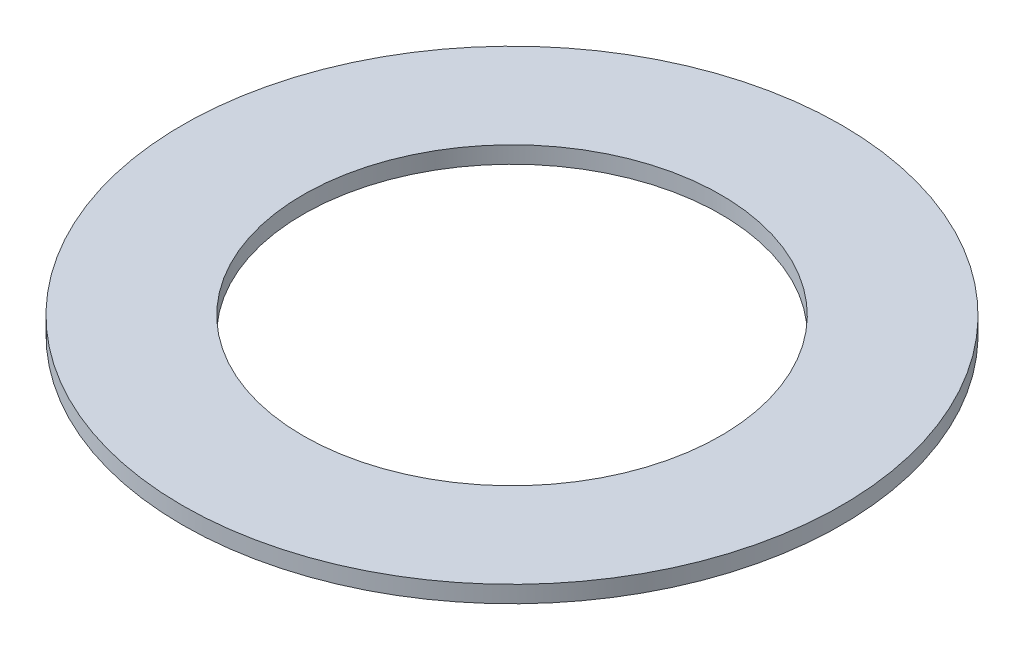
ISO-10303-21;
HEADER;
FILE_DESCRIPTION(('STEP AP214'),'2;1');
FILE_NAME('part.step','',(''),(''),'','','');
FILE_SCHEMA(('AUTOMOTIVE_DESIGN { 1 0 10303 214 1 1 1 1 }'));
ENDSEC;
DATA;
#1=APPLICATION_CONTEXT('core data for automotive mechanical design processes');
#2=APPLICATION_PROTOCOL_DEFINITION('international standard','automotive_design',2000,#1);
#3=PRODUCT_CONTEXT('',#1,'mechanical');
#4=PRODUCT('Part','Part','',(#3));
#5=PRODUCT_RELATED_PRODUCT_CATEGORY('part','',(#4));
#6=PRODUCT_DEFINITION_FORMATION('','',#4);
#7=PRODUCT_DEFINITION_CONTEXT('part definition',#1,'design');
#8=PRODUCT_DEFINITION('design','',#6,#7);
#9=PRODUCT_DEFINITION_SHAPE('','',#8);
#10=(LENGTH_UNIT() NAMED_UNIT(*) SI_UNIT(.MILLI.,.METRE.));
#11=(NAMED_UNIT(*) PLANE_ANGLE_UNIT() SI_UNIT($,.RADIAN.));
#12=(NAMED_UNIT(*) SI_UNIT($,.STERADIAN.) SOLID_ANGLE_UNIT());
#13=UNCERTAINTY_MEASURE_WITH_UNIT(LENGTH_MEASURE(1.E-05),#10,'distance_accuracy_value','');
#14=(GEOMETRIC_REPRESENTATION_CONTEXT(3) GLOBAL_UNCERTAINTY_ASSIGNED_CONTEXT((#13)) GLOBAL_UNIT_ASSIGNED_CONTEXT((#10,
#11,#12)) REPRESENTATION_CONTEXT('',''));
#15=CARTESIAN_POINT('',(0.,0.,0.));
#16=DIRECTION('',(0.,0.,1.));
#17=DIRECTION('',(1.,0.,0.));
#18=AXIS2_PLACEMENT_3D('',#15,#16,#17);
#19=CARTESIAN_POINT('',(0.,4.,0.));
#20=DIRECTION('',(0.,1.,0.));
#21=DIRECTION('',(0.,0.,1.));
#22=AXIS2_PLACEMENT_3D('',#19,#20,#21);
#23=PLANE('',#22);
#24=CARTESIAN_POINT('',(0.,4.,0.));
#25=DIRECTION('',(0.,1.,0.));
#26=DIRECTION('',(0.,0.,1.));
#27=AXIS2_PLACEMENT_3D('',#24,#25,#26);
#28=CIRCLE('',#27,78.2);
#29=CARTESIAN_POINT('',(0.,4.,78.2));
#30=VERTEX_POINT('',#29);
#31=EDGE_CURVE('E10',#30,#30,#28,.T.);
#32=ORIENTED_EDGE('',*,*,#31,.T.);
#33=EDGE_LOOP('',(#32));
#34=FACE_BOUND('',#33,.T.);
#35=CARTESIAN_POINT('',(0.,4.,0.));
#36=DIRECTION('',(0.,1.,0.));
#37=DIRECTION('',(0.,0.,1.));
#38=AXIS2_PLACEMENT_3D('',#35,#36,#37);
#39=CIRCLE('',#38,49.55);
#40=CARTESIAN_POINT('',(0.,4.,49.55));
#41=VERTEX_POINT('',#40);
#42=EDGE_CURVE('E43',#41,#41,#39,.T.);
#43=ORIENTED_EDGE('',*,*,#42,.F.);
#44=EDGE_LOOP('',(#43));
#45=FACE_BOUND('',#44,.T.);
#46=ADVANCED_FACE('F32',(#34,#45),#23,.T.);
#47=CARTESIAN_POINT('',(0.,0.,0.));
#48=DIRECTION('',(0.,1.,0.));
#49=DIRECTION('',(0.,0.,1.));
#50=AXIS2_PLACEMENT_3D('',#47,#48,#49);
#51=PLANE('',#50);
#52=CARTESIAN_POINT('',(0.,0.,0.));
#53=DIRECTION('',(0.,1.,0.));
#54=DIRECTION('',(0.,0.,1.));
#55=AXIS2_PLACEMENT_3D('',#52,#53,#54);
#56=CIRCLE('',#55,78.2);
#57=CARTESIAN_POINT('',(0.,0.,78.2));
#58=VERTEX_POINT('',#57);
#59=EDGE_CURVE('E36',#58,#58,#56,.T.);
#60=ORIENTED_EDGE('',*,*,#59,.F.);
#61=EDGE_LOOP('',(#60));
#62=FACE_BOUND('',#61,.T.);
#63=CARTESIAN_POINT('',(0.,0.,0.));
#64=DIRECTION('',(0.,1.,0.));
#65=DIRECTION('',(0.,0.,1.));
#66=AXIS2_PLACEMENT_3D('',#63,#64,#65);
#67=CIRCLE('',#66,49.55);
#68=CARTESIAN_POINT('',(0.,0.,49.55));
#69=VERTEX_POINT('',#68);
#70=EDGE_CURVE('E45',#69,#69,#67,.T.);
#71=ORIENTED_EDGE('',*,*,#70,.T.);
#72=EDGE_LOOP('',(#71));
#73=FACE_BOUND('',#72,.T.);
#74=ADVANCED_FACE('F55',(#62,#73),#51,.F.);
#75=CARTESIAN_POINT('',(0.,4.,0.));
#76=DIRECTION('',(0.,-1.,0.));
#77=DIRECTION('',(0.,0.,-1.));
#78=AXIS2_PLACEMENT_3D('',#75,#76,#77);
#79=CYLINDRICAL_SURFACE('',#78,78.2);
#80=ORIENTED_EDGE('',*,*,#31,.F.);
#81=EDGE_LOOP('',(#80));
#82=FACE_BOUND('',#81,.T.);
#83=ORIENTED_EDGE('',*,*,#59,.T.);
#84=EDGE_LOOP('',(#83));
#85=FACE_BOUND('',#84,.T.);
#86=ADVANCED_FACE('F34',(#82,#85),#79,.T.);
#87=CARTESIAN_POINT('',(0.,4.,0.));
#88=DIRECTION('',(0.,-1.,0.));
#89=DIRECTION('',(0.,0.,-1.));
#90=AXIS2_PLACEMENT_3D('',#87,#88,#89);
#91=CYLINDRICAL_SURFACE('',#90,49.55);
#92=ORIENTED_EDGE('',*,*,#42,.T.);
#93=EDGE_LOOP('',(#92));
#94=FACE_BOUND('',#93,.T.);
#95=ORIENTED_EDGE('',*,*,#70,.F.);
#96=EDGE_LOOP('',(#95));
#97=FACE_BOUND('',#96,.T.);
#98=ADVANCED_FACE('F51',(#94,#97),#91,.F.);
#99=CLOSED_SHELL('',(#46,#74,#86,#98));
#100=MANIFOLD_SOLID_BREP('B2',#99);
#101=ADVANCED_BREP_SHAPE_REPRESENTATION('',(#18,#100),#14);
#102=SHAPE_DEFINITION_REPRESENTATION(#9,#101);
ENDSEC;
END-ISO-10303-21;
